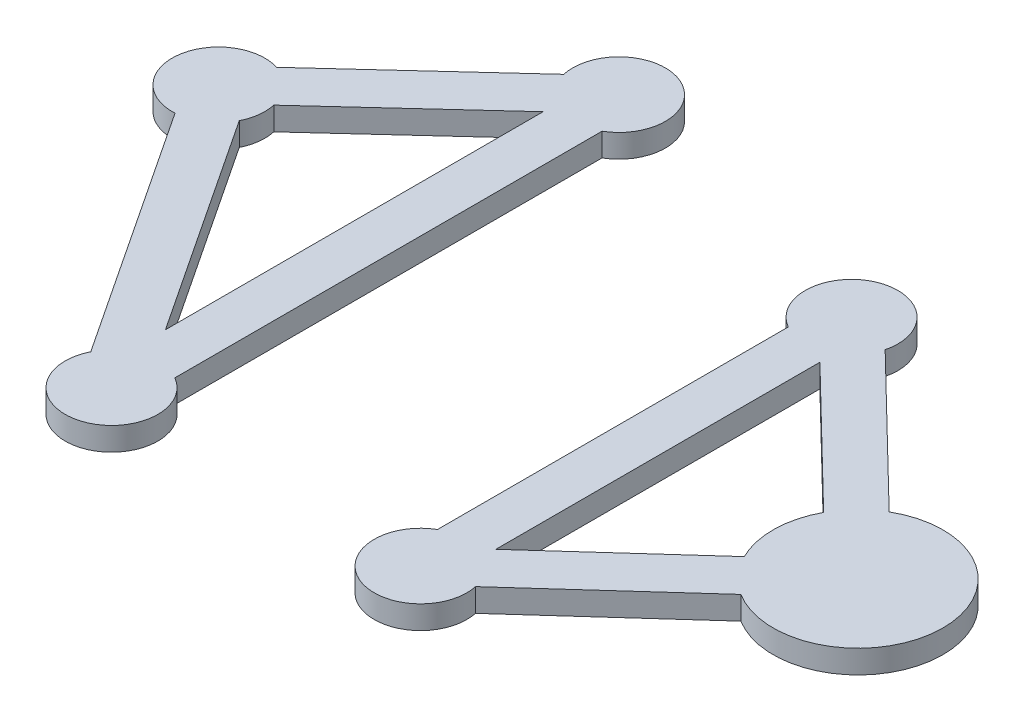
ISO-10303-21;
HEADER;
FILE_DESCRIPTION(('STEP AP214'),'2;1');
FILE_NAME('part.step','',(''),(''),'','','');
FILE_SCHEMA(('AUTOMOTIVE_DESIGN { 1 0 10303 214 1 1 1 1 }'));
ENDSEC;
DATA;
#1=APPLICATION_CONTEXT('core data for automotive mechanical design processes');
#2=APPLICATION_PROTOCOL_DEFINITION('international standard','automotive_design',2000,#1);
#3=PRODUCT_CONTEXT('',#1,'mechanical');
#4=PRODUCT('Part','Part','',(#3));
#5=PRODUCT_RELATED_PRODUCT_CATEGORY('part','',(#4));
#6=PRODUCT_DEFINITION_FORMATION('','',#4);
#7=PRODUCT_DEFINITION_CONTEXT('part definition',#1,'design');
#8=PRODUCT_DEFINITION('design','',#6,#7);
#9=PRODUCT_DEFINITION_SHAPE('','',#8);
#10=(LENGTH_UNIT() NAMED_UNIT(*) SI_UNIT(.MILLI.,.METRE.));
#11=(NAMED_UNIT(*) PLANE_ANGLE_UNIT() SI_UNIT($,.RADIAN.));
#12=(NAMED_UNIT(*) SI_UNIT($,.STERADIAN.) SOLID_ANGLE_UNIT());
#13=UNCERTAINTY_MEASURE_WITH_UNIT(LENGTH_MEASURE(1.E-05),#10,'distance_accuracy_value','');
#14=(GEOMETRIC_REPRESENTATION_CONTEXT(3) GLOBAL_UNCERTAINTY_ASSIGNED_CONTEXT((#13)) GLOBAL_UNIT_ASSIGNED_CONTEXT((#10,
#11,#12)) REPRESENTATION_CONTEXT('',''));
#15=CARTESIAN_POINT('',(0.,0.,0.));
#16=DIRECTION('',(0.,0.,1.));
#17=DIRECTION('',(1.,0.,0.));
#18=AXIS2_PLACEMENT_3D('',#15,#16,#17);
#19=CARTESIAN_POINT('',(0.,3.,0.));
#20=DIRECTION('',(0.,1.,0.));
#21=DIRECTION('',(0.,0.,1.));
#22=AXIS2_PLACEMENT_3D('',#19,#20,#21);
#23=PLANE('',#22);
#24=CARTESIAN_POINT('',(0.,3.,0.));
#25=DIRECTION('',(0.,1.,0.));
#26=DIRECTION('',(0.,0.,1.));
#27=AXIS2_PLACEMENT_3D('',#24,#25,#26);
#28=CIRCLE('',#27,6.);
#29=CARTESIAN_POINT('',(-2.99999999999999,3.,-5.19615242270664));
#30=VERTEX_POINT('',#29);
#31=CARTESIAN_POINT('',(5.86702734938971,3.,-1.2561807519275));
#32=VERTEX_POINT('',#31);
#33=EDGE_CURVE('E166',#30,#32,#28,.T.);
#34=ORIENTED_EDGE('',*,*,#33,.T.);
#35=DIRECTION('',(0.742150725550953,0.,-0.670233019601537));
#36=VECTOR('',#35,1.);
#37=CARTESIAN_POINT('',(5.86702734938971,3.,-1.2561807519275));
#38=LINE('',#37,#36);
#39=CARTESIAN_POINT('',(23.916758132862,3.,-17.5568123480505));
#40=VERTEX_POINT('',#39);
#41=EDGE_CURVE('E170',#32,#40,#38,.T.);
#42=ORIENTED_EDGE('',*,*,#41,.T.);
#43=CARTESIAN_POINT('',(29.7602440945933,3.,-26.8763440860215));
#44=DIRECTION('',(0.,1.,0.));
#45=DIRECTION('',(0.,0.,1.));
#46=AXIS2_PLACEMENT_3D('',#43,#44,#45);
#47=CIRCLE('',#46,11.);
#48=CARTESIAN_POINT('',(24.2618862251584,3.,-36.4035714234803));
#49=VERTEX_POINT('',#48);
#50=EDGE_CURVE('E172',#40,#49,#47,.T.);
#51=ORIENTED_EDGE('',*,*,#50,.T.);
#52=DIRECTION('',(-0.717114315532369,0.,-0.696955564192253));
#53=VECTOR('',#52,1.);
#54=CARTESIAN_POINT('',(5.81710198058792,3.,-54.3298556032008));
#55=LINE('',#54,#53);
#56=CARTESIAN_POINT('',(5.81710198058792,3.,-54.3298556032008));
#57=VERTEX_POINT('',#56);
#58=EDGE_CURVE('E174',#49,#57,#55,.T.);
#59=ORIENTED_EDGE('',*,*,#58,.T.);
#60=CARTESIAN_POINT('',(0.,3.,-55.8));
#61=DIRECTION('',(0.,1.,0.));
#62=DIRECTION('',(0.,0.,1.));
#63=AXIS2_PLACEMENT_3D('',#60,#61,#62);
#64=CIRCLE('',#63,6.);
#65=CARTESIAN_POINT('',(-3.,3.,-50.6038475772934));
#66=VERTEX_POINT('',#65);
#67=EDGE_CURVE('E176',#57,#66,#64,.T.);
#68=ORIENTED_EDGE('',*,*,#67,.T.);
#69=DIRECTION('',(0.,0.,1.));
#70=VECTOR('',#69,1.);
#71=CARTESIAN_POINT('',(-3.,3.,-50.6038475772934));
#72=LINE('',#71,#70);
#73=EDGE_CURVE('E178',#66,#30,#72,.T.);
#74=ORIENTED_EDGE('',*,*,#73,.T.);
#75=EDGE_LOOP('',(#34,#42,#51,#59,#68,#74));
#76=FACE_BOUND('',#75,.T.);
#77=DIRECTION('',(-0.717114315532369,0.,-0.696955564192253));
#78=VECTOR('',#77,1.);
#79=CARTESIAN_POINT('',(3.00000000000001,3.,-48.7008993652603));
#80=LINE('',#79,#78);
#81=CARTESIAN_POINT('',(20.0801528400048,3.,-32.1008855302861));
#82=VERTEX_POINT('',#81);
#83=CARTESIAN_POINT('',(3.00000000000001,3.,-48.7008993652603));
#84=VERTEX_POINT('',#83);
#85=EDGE_CURVE('E81',#82,#84,#80,.T.);
#86=ORIENTED_EDGE('',*,*,#85,.F.);
#87=CARTESIAN_POINT('',(29.7602440945933,3.,-26.8763440860215));
#88=DIRECTION('',(0.,-1.,0.));
#89=DIRECTION('',(0.,0.,1.));
#90=AXIS2_PLACEMENT_3D('',#87,#88,#89);
#91=CIRCLE('',#90,11.);
#92=CARTESIAN_POINT('',(19.8953600152528,3.,-22.0097167013562));
#93=VERTEX_POINT('',#92);
#94=EDGE_CURVE('E55',#93,#82,#91,.T.);
#95=ORIENTED_EDGE('',*,*,#94,.F.);
#96=DIRECTION('',(0.742150725550956,0.,-0.670233019601534));
#97=VECTOR('',#96,1.);
#98=CARTESIAN_POINT('',(19.8953600152528,3.,-22.0097167013562));
#99=LINE('',#98,#97);
#100=CARTESIAN_POINT('',(3.,3.,-6.75159221206013));
#101=VERTEX_POINT('',#100);
#102=EDGE_CURVE('E137',#101,#93,#99,.T.);
#103=ORIENTED_EDGE('',*,*,#102,.F.);
#104=DIRECTION('',(0.,0.,1.));
#105=VECTOR('',#104,1.);
#106=CARTESIAN_POINT('',(3.00000000000001,3.,-6.75159221206013));
#107=LINE('',#106,#105);
#108=EDGE_CURVE('E145',#84,#101,#107,.T.);
#109=ORIENTED_EDGE('',*,*,#108,.F.);
#110=EDGE_LOOP('',(#86,#95,#103,#109));
#111=FACE_BOUND('',#110,.T.);
#112=ADVANCED_FACE('F51',(#76,#111),#23,.T.);
#113=CARTESIAN_POINT('',(0.,0.,0.));
#114=DIRECTION('',(0.,1.,0.));
#115=DIRECTION('',(0.,0.,1.));
#116=AXIS2_PLACEMENT_3D('',#113,#114,#115);
#117=PLANE('',#116);
#118=CARTESIAN_POINT('',(0.,0.,0.));
#119=DIRECTION('',(0.,1.,0.));
#120=DIRECTION('',(0.,0.,1.));
#121=AXIS2_PLACEMENT_3D('',#118,#119,#120);
#122=CIRCLE('',#121,6.);
#123=CARTESIAN_POINT('',(-2.99999999999999,0.,-5.19615242270664));
#124=VERTEX_POINT('',#123);
#125=CARTESIAN_POINT('',(5.86702734938971,0.,-1.2561807519275));
#126=VERTEX_POINT('',#125);
#127=EDGE_CURVE('E159',#124,#126,#122,.T.);
#128=ORIENTED_EDGE('',*,*,#127,.F.);
#129=DIRECTION('',(0.,0.,1.));
#130=VECTOR('',#129,1.);
#131=CARTESIAN_POINT('',(-3.,0.,-50.6038475772934));
#132=LINE('',#131,#130);
#133=CARTESIAN_POINT('',(-3.,0.,-50.6038475772934));
#134=VERTEX_POINT('',#133);
#135=EDGE_CURVE('E169',#134,#124,#132,.T.);
#136=ORIENTED_EDGE('',*,*,#135,.F.);
#137=CARTESIAN_POINT('',(0.,0.,-55.8));
#138=DIRECTION('',(0.,1.,0.));
#139=DIRECTION('',(0.,0.,1.));
#140=AXIS2_PLACEMENT_3D('',#137,#138,#139);
#141=CIRCLE('',#140,6.);
#142=CARTESIAN_POINT('',(5.81710198058792,0.,-54.3298556032008));
#143=VERTEX_POINT('',#142);
#144=EDGE_CURVE('E186',#143,#134,#141,.T.);
#145=ORIENTED_EDGE('',*,*,#144,.F.);
#146=DIRECTION('',(-0.717114315532369,0.,-0.696955564192253));
#147=VECTOR('',#146,1.);
#148=CARTESIAN_POINT('',(5.81710198058792,0.,-54.3298556032008));
#149=LINE('',#148,#147);
#150=CARTESIAN_POINT('',(24.2618862251584,0.,-36.4035714234803));
#151=VERTEX_POINT('',#150);
#152=EDGE_CURVE('E184',#151,#143,#149,.T.);
#153=ORIENTED_EDGE('',*,*,#152,.F.);
#154=CARTESIAN_POINT('',(29.7602440945933,0.,-26.8763440860215));
#155=DIRECTION('',(0.,1.,0.));
#156=DIRECTION('',(0.,0.,1.));
#157=AXIS2_PLACEMENT_3D('',#154,#155,#156);
#158=CIRCLE('',#157,11.);
#159=CARTESIAN_POINT('',(23.916758132862,0.,-17.5568123480505));
#160=VERTEX_POINT('',#159);
#161=EDGE_CURVE('E182',#160,#151,#158,.T.);
#162=ORIENTED_EDGE('',*,*,#161,.F.);
#163=DIRECTION('',(0.742150725550953,0.,-0.670233019601537));
#164=VECTOR('',#163,1.);
#165=CARTESIAN_POINT('',(5.86702734938971,0.,-1.2561807519275));
#166=LINE('',#165,#164);
#167=EDGE_CURVE('E163',#126,#160,#166,.T.);
#168=ORIENTED_EDGE('',*,*,#167,.F.);
#169=EDGE_LOOP('',(#128,#136,#145,#153,#162,#168));
#170=FACE_BOUND('',#169,.T.);
#171=CARTESIAN_POINT('',(29.7602440945933,0.,-26.8763440860215));
#172=DIRECTION('',(0.,-1.,0.));
#173=DIRECTION('',(0.,0.,1.));
#174=AXIS2_PLACEMENT_3D('',#171,#172,#173);
#175=CIRCLE('',#174,11.);
#176=CARTESIAN_POINT('',(19.8953600152528,0.,-22.0097167013562));
#177=VERTEX_POINT('',#176);
#178=CARTESIAN_POINT('',(20.0801528400048,0.,-32.1008855302861));
#179=VERTEX_POINT('',#178);
#180=EDGE_CURVE('E12',#177,#179,#175,.T.);
#181=ORIENTED_EDGE('',*,*,#180,.T.);
#182=DIRECTION('',(-0.717114315532369,0.,-0.696955564192253));
#183=VECTOR('',#182,1.);
#184=CARTESIAN_POINT('',(3.00000000000001,0.,-48.7008993652603));
#185=LINE('',#184,#183);
#186=CARTESIAN_POINT('',(3.00000000000001,0.,-48.7008993652603));
#187=VERTEX_POINT('',#186);
#188=EDGE_CURVE('E61',#179,#187,#185,.T.);
#189=ORIENTED_EDGE('',*,*,#188,.T.);
#190=DIRECTION('',(0.,0.,1.));
#191=VECTOR('',#190,1.);
#192=CARTESIAN_POINT('',(3.00000000000001,0.,-6.75159221206013));
#193=LINE('',#192,#191);
#194=CARTESIAN_POINT('',(3.00000000000001,0.,-6.75159221206013));
#195=VERTEX_POINT('',#194);
#196=EDGE_CURVE('E152',#187,#195,#193,.T.);
#197=ORIENTED_EDGE('',*,*,#196,.T.);
#198=DIRECTION('',(0.742150725550956,0.,-0.670233019601534));
#199=VECTOR('',#198,1.);
#200=CARTESIAN_POINT('',(19.8953600152528,0.,-22.0097167013562));
#201=LINE('',#200,#199);
#202=EDGE_CURVE('E139',#195,#177,#201,.T.);
#203=ORIENTED_EDGE('',*,*,#202,.T.);
#204=EDGE_LOOP('',(#181,#189,#197,#203));
#205=FACE_BOUND('',#204,.T.);
#206=ADVANCED_FACE('F156',(#170,#205),#117,.F.);
#207=CARTESIAN_POINT('',(0.,3.,0.));
#208=DIRECTION('',(0.,-1.,0.));
#209=DIRECTION('',(0.,0.,-1.));
#210=AXIS2_PLACEMENT_3D('',#207,#208,#209);
#211=CYLINDRICAL_SURFACE('',#210,6.);
#212=ORIENTED_EDGE('',*,*,#127,.T.);
#213=DIRECTION('',(0.,-1.,0.));
#214=VECTOR('',#213,1.);
#215=CARTESIAN_POINT('',(5.86702734938971,3.,-1.2561807519275));
#216=LINE('',#215,#214);
#217=EDGE_CURVE('E203',#32,#126,#216,.T.);
#218=ORIENTED_EDGE('',*,*,#217,.F.);
#219=ORIENTED_EDGE('',*,*,#33,.F.);
#220=DIRECTION('',(0.,-1.,0.));
#221=VECTOR('',#220,1.);
#222=CARTESIAN_POINT('',(-2.99999999999999,3.,-5.19615242270664));
#223=LINE('',#222,#221);
#224=EDGE_CURVE('E179',#30,#124,#223,.T.);
#225=ORIENTED_EDGE('',*,*,#224,.T.);
#226=EDGE_LOOP('',(#212,#218,#219,#225));
#227=FACE_BOUND('',#226,.T.);
#228=ADVANCED_FACE('F212',(#227),#211,.T.);
#229=CARTESIAN_POINT('',(5.86702734938971,3.,-1.2561807519275));
#230=DIRECTION('',(-0.670233019601537,0.,-0.742150725550953));
#231=DIRECTION('',(-0.742150725550953,0.,0.670233019601537));
#232=AXIS2_PLACEMENT_3D('',#229,#230,#231);
#233=PLANE('',#232);
#234=ORIENTED_EDGE('',*,*,#167,.T.);
#235=DIRECTION('',(0.,-1.,0.));
#236=VECTOR('',#235,1.);
#237=CARTESIAN_POINT('',(23.916758132862,3.,-17.5568123480505));
#238=LINE('',#237,#236);
#239=EDGE_CURVE('E200',#40,#160,#238,.T.);
#240=ORIENTED_EDGE('',*,*,#239,.F.);
#241=ORIENTED_EDGE('',*,*,#41,.F.);
#242=ORIENTED_EDGE('',*,*,#217,.T.);
#243=EDGE_LOOP('',(#234,#240,#241,#242));
#244=FACE_BOUND('',#243,.T.);
#245=ADVANCED_FACE('F207',(#244),#233,.F.);
#246=CARTESIAN_POINT('',(29.7602440945933,3.,-26.8763440860215));
#247=DIRECTION('',(0.,-1.,0.));
#248=DIRECTION('',(0.,0.,-1.));
#249=AXIS2_PLACEMENT_3D('',#246,#247,#248);
#250=CYLINDRICAL_SURFACE('',#249,11.);
#251=ORIENTED_EDGE('',*,*,#161,.T.);
#252=DIRECTION('',(0.,-1.,0.));
#253=VECTOR('',#252,1.);
#254=CARTESIAN_POINT('',(24.2618862251584,3.,-36.4035714234803));
#255=LINE('',#254,#253);
#256=EDGE_CURVE('E197',#49,#151,#255,.T.);
#257=ORIENTED_EDGE('',*,*,#256,.F.);
#258=ORIENTED_EDGE('',*,*,#50,.F.);
#259=ORIENTED_EDGE('',*,*,#239,.T.);
#260=EDGE_LOOP('',(#251,#257,#258,#259));
#261=FACE_BOUND('',#260,.T.);
#262=ADVANCED_FACE('F221',(#261),#250,.T.);
#263=CARTESIAN_POINT('',(5.81710198058792,3.,-54.3298556032008));
#264=DIRECTION('',(-0.696955564192253,0.,0.717114315532369));
#265=DIRECTION('',(0.717114315532369,0.,0.696955564192253));
#266=AXIS2_PLACEMENT_3D('',#263,#264,#265);
#267=PLANE('',#266);
#268=ORIENTED_EDGE('',*,*,#152,.T.);
#269=DIRECTION('',(0.,-1.,0.));
#270=VECTOR('',#269,1.);
#271=CARTESIAN_POINT('',(5.81710198058792,3.,-54.3298556032008));
#272=LINE('',#271,#270);
#273=EDGE_CURVE('E194',#57,#143,#272,.T.);
#274=ORIENTED_EDGE('',*,*,#273,.F.);
#275=ORIENTED_EDGE('',*,*,#58,.F.);
#276=ORIENTED_EDGE('',*,*,#256,.T.);
#277=EDGE_LOOP('',(#268,#274,#275,#276));
#278=FACE_BOUND('',#277,.T.);
#279=ADVANCED_FACE('F225',(#278),#267,.F.);
#280=CARTESIAN_POINT('',(0.,3.,-55.8));
#281=DIRECTION('',(0.,-1.,0.));
#282=DIRECTION('',(0.,0.,-1.));
#283=AXIS2_PLACEMENT_3D('',#280,#281,#282);
#284=CYLINDRICAL_SURFACE('',#283,6.);
#285=ORIENTED_EDGE('',*,*,#144,.T.);
#286=DIRECTION('',(0.,-1.,0.));
#287=VECTOR('',#286,1.);
#288=CARTESIAN_POINT('',(-3.,3.,-50.6038475772934));
#289=LINE('',#288,#287);
#290=EDGE_CURVE('E191',#66,#134,#289,.T.);
#291=ORIENTED_EDGE('',*,*,#290,.F.);
#292=ORIENTED_EDGE('',*,*,#67,.F.);
#293=ORIENTED_EDGE('',*,*,#273,.T.);
#294=EDGE_LOOP('',(#285,#291,#292,#293));
#295=FACE_BOUND('',#294,.T.);
#296=ADVANCED_FACE('F234',(#295),#284,.T.);
#297=CARTESIAN_POINT('',(-3.,3.,-50.6038475772934));
#298=DIRECTION('',(1.,0.,0.));
#299=DIRECTION('',(0.,0.,-1.));
#300=AXIS2_PLACEMENT_3D('',#297,#298,#299);
#301=PLANE('',#300);
#302=ORIENTED_EDGE('',*,*,#135,.T.);
#303=ORIENTED_EDGE('',*,*,#224,.F.);
#304=ORIENTED_EDGE('',*,*,#73,.F.);
#305=ORIENTED_EDGE('',*,*,#290,.T.);
#306=EDGE_LOOP('',(#302,#303,#304,#305));
#307=FACE_BOUND('',#306,.T.);
#308=ADVANCED_FACE('F232',(#307),#301,.F.);
#309=CARTESIAN_POINT('',(29.7602440945933,3.,-26.8763440860215));
#310=DIRECTION('',(0.,-1.,0.));
#311=DIRECTION('',(0.,0.,-1.));
#312=AXIS2_PLACEMENT_3D('',#309,#310,#311);
#313=CYLINDRICAL_SURFACE('',#312,11.);
#314=ORIENTED_EDGE('',*,*,#180,.F.);
#315=DIRECTION('',(0.,-1.,0.));
#316=VECTOR('',#315,1.);
#317=CARTESIAN_POINT('',(19.8953600152528,3.,-22.0097167013562));
#318=LINE('',#317,#316);
#319=EDGE_CURVE('E141',#93,#177,#318,.T.);
#320=ORIENTED_EDGE('',*,*,#319,.F.);
#321=ORIENTED_EDGE('',*,*,#94,.T.);
#322=DIRECTION('',(0.,-1.,0.));
#323=VECTOR('',#322,1.);
#324=CARTESIAN_POINT('',(20.0801528400048,3.,-32.1008855302861));
#325=LINE('',#324,#323);
#326=EDGE_CURVE('E158',#82,#179,#325,.T.);
#327=ORIENTED_EDGE('',*,*,#326,.T.);
#328=EDGE_LOOP('',(#314,#320,#321,#327));
#329=FACE_BOUND('',#328,.T.);
#330=ADVANCED_FACE('F157',(#329),#313,.T.);
#331=CARTESIAN_POINT('',(3.00000000000001,3.,-48.7008993652603));
#332=DIRECTION('',(-0.696955564192253,0.,0.717114315532369));
#333=DIRECTION('',(0.717114315532369,0.,0.696955564192253));
#334=AXIS2_PLACEMENT_3D('',#331,#332,#333);
#335=PLANE('',#334);
#336=ORIENTED_EDGE('',*,*,#188,.F.);
#337=ORIENTED_EDGE('',*,*,#326,.F.);
#338=ORIENTED_EDGE('',*,*,#85,.T.);
#339=DIRECTION('',(0.,-1.,0.));
#340=VECTOR('',#339,1.);
#341=CARTESIAN_POINT('',(3.00000000000001,3.,-48.7008993652603));
#342=LINE('',#341,#340);
#343=EDGE_CURVE('E142',#84,#187,#342,.T.);
#344=ORIENTED_EDGE('',*,*,#343,.T.);
#345=EDGE_LOOP('',(#336,#337,#338,#344));
#346=FACE_BOUND('',#345,.T.);
#347=ADVANCED_FACE('F252',(#346),#335,.T.);
#348=CARTESIAN_POINT('',(3.00000000000001,3.,-6.75159221206013));
#349=DIRECTION('',(1.,0.,0.));
#350=DIRECTION('',(0.,0.,-1.));
#351=AXIS2_PLACEMENT_3D('',#348,#349,#350);
#352=PLANE('',#351);
#353=ORIENTED_EDGE('',*,*,#196,.F.);
#354=ORIENTED_EDGE('',*,*,#343,.F.);
#355=ORIENTED_EDGE('',*,*,#108,.T.);
#356=DIRECTION('',(0.,-1.,0.));
#357=VECTOR('',#356,1.);
#358=CARTESIAN_POINT('',(3.00000000000001,3.,-6.75159221206013));
#359=LINE('',#358,#357);
#360=EDGE_CURVE('E92',#101,#195,#359,.T.);
#361=ORIENTED_EDGE('',*,*,#360,.T.);
#362=EDGE_LOOP('',(#353,#354,#355,#361));
#363=FACE_BOUND('',#362,.T.);
#364=ADVANCED_FACE('F146',(#363),#352,.T.);
#365=CARTESIAN_POINT('',(19.8953600152528,3.,-22.0097167013562));
#366=DIRECTION('',(-0.670233019601534,0.,-0.742150725550956));
#367=DIRECTION('',(-0.742150725550956,0.,0.670233019601534));
#368=AXIS2_PLACEMENT_3D('',#365,#366,#367);
#369=PLANE('',#368);
#370=ORIENTED_EDGE('',*,*,#202,.F.);
#371=ORIENTED_EDGE('',*,*,#360,.F.);
#372=ORIENTED_EDGE('',*,*,#102,.T.);
#373=ORIENTED_EDGE('',*,*,#319,.T.);
#374=EDGE_LOOP('',(#370,#371,#372,#373));
#375=FACE_BOUND('',#374,.T.);
#376=ADVANCED_FACE('F53',(#375),#369,.T.);
#377=CLOSED_SHELL('',(#112,#206,#228,#245,#262,#279,#296,#308,#330,#347,#364,#376));
#378=MANIFOLD_SOLID_BREP('B2',#377);
#379=CARTESIAN_POINT('',(-67.0271654386819,3.,-40.8721461187215));
#380=DIRECTION('',(0.,-1.,0.));
#381=DIRECTION('',(0.,0.,-1.));
#382=AXIS2_PLACEMENT_3D('',#379,#380,#381);
#383=PLANE('',#382);
#384=CARTESIAN_POINT('',(-67.0271654386819,3.,-40.8721461187215));
#385=DIRECTION('',(0.,1.,0.));
#386=DIRECTION('',(0.,0.,-1.));
#387=AXIS2_PLACEMENT_3D('',#384,#385,#386);
#388=CIRCLE('',#387,6.);
#389=CARTESIAN_POINT('',(-65.2300616367947,3.,-46.5966913343035));
#390=VERTEX_POINT('',#389);
#391=CARTESIAN_POINT('',(-66.6634749730303,3.,-34.883178825006));
#392=VERTEX_POINT('',#391);
#393=EDGE_CURVE('E446',#390,#392,#388,.T.);
#394=ORIENTED_EDGE('',*,*,#393,.T.);
#395=DIRECTION('',(0.551574804871062,0.,0.834125430994314));
#396=VECTOR('',#395,1.);
#397=CARTESIAN_POINT('',(-66.6634749730303,3.,-34.883178825006));
#398=LINE('',#397,#396);
#399=CARTESIAN_POINT('',(-45.3684430516176,3.,-2.67951846448914));
#400=VERTEX_POINT('',#399);
#401=EDGE_CURVE('E449',#392,#400,#398,.T.);
#402=ORIENTED_EDGE('',*,*,#401,.T.);
#403=CARTESIAN_POINT('',(-40.,3.,0.));
#404=DIRECTION('',(0.,1.,0.));
#405=DIRECTION('',(0.,0.,1.));
#406=AXIS2_PLACEMENT_3D('',#403,#404,#405);
#407=CIRCLE('',#406,5.99999999999999);
#408=CARTESIAN_POINT('',(-37.,3.,-5.19615242270662));
#409=VERTEX_POINT('',#408);
#410=EDGE_CURVE('E452',#400,#409,#407,.T.);
#411=ORIENTED_EDGE('',*,*,#410,.T.);
#412=DIRECTION('',(0.,0.,-1.));
#413=VECTOR('',#412,1.);
#414=CARTESIAN_POINT('',(-37.,3.,-60.5038475772934));
#415=LINE('',#414,#413);
#416=CARTESIAN_POINT('',(-37.,3.,-60.5038475772934));
#417=VERTEX_POINT('',#416);
#418=EDGE_CURVE('E454',#409,#417,#415,.T.);
#419=ORIENTED_EDGE('',*,*,#418,.T.);
#420=CARTESIAN_POINT('',(-40.,3.,-65.7));
#421=DIRECTION('',(0.,1.,0.));
#422=DIRECTION('',(0.,0.,-1.));
#423=AXIS2_PLACEMENT_3D('',#420,#421,#422);
#424=CIRCLE('',#423,6.00000000000001);
#425=CARTESIAN_POINT('',(-45.8561534827503,3.,-64.3940649378811));
#426=VERTEX_POINT('',#425);
#427=EDGE_CURVE('E456',#417,#426,#424,.T.);
#428=ORIENTED_EDGE('',*,*,#427,.T.);
#429=DIRECTION('',(-0.736435025577166,0.,0.676508280143827));
#430=VECTOR('',#429,1.);
#431=CARTESIAN_POINT('',(-65.2300616367947,3.,-46.5966913343035));
#432=LINE('',#431,#430);
#433=EDGE_CURVE('E458',#426,#390,#432,.T.);
#434=ORIENTED_EDGE('',*,*,#433,.T.);
#435=EDGE_LOOP('',(#394,#402,#411,#419,#428,#434));
#436=FACE_BOUND('',#435,.T.);
#437=DIRECTION('',(0.,0.,-1.));
#438=VECTOR('',#437,1.);
#439=CARTESIAN_POINT('',(-43.,3.,-58.8704431949177));
#440=LINE('',#439,#438);
#441=CARTESIAN_POINT('',(-43.,3.,-9.97575713101908));
#442=VERTEX_POINT('',#441);
#443=CARTESIAN_POINT('',(-43.,3.,-58.8704431949177));
#444=VERTEX_POINT('',#443);
#445=EDGE_CURVE('E410',#442,#444,#440,.T.);
#446=ORIENTED_EDGE('',*,*,#445,.F.);
#447=DIRECTION('',(0.551574804871059,0.,0.834125430994316));
#448=VECTOR('',#447,1.);
#449=CARTESIAN_POINT('',(-43.,3.,-9.97575713101908));
#450=LINE('',#449,#448);
#451=CARTESIAN_POINT('',(-61.6587223870643,3.,-38.1926276542323));
#452=VERTEX_POINT('',#451);
#453=EDGE_CURVE('E432',#452,#442,#450,.T.);
#454=ORIENTED_EDGE('',*,*,#453,.F.);
#455=CARTESIAN_POINT('',(-67.0271654386819,3.,-40.8721461187215));
#456=DIRECTION('',(0.,-1.,0.));
#457=DIRECTION('',(0.,0.,-1.));
#458=AXIS2_PLACEMENT_3D('',#455,#456,#457);
#459=CIRCLE('',#458,5.99999999999999);
#460=CARTESIAN_POINT('',(-61.1710119559316,3.,-42.1780811808404));
#461=VERTEX_POINT('',#460);
#462=EDGE_CURVE('E430',#461,#452,#459,.T.);
#463=ORIENTED_EDGE('',*,*,#462,.F.);
#464=DIRECTION('',(-0.736435025577164,0.,0.67650828014383));
#465=VECTOR('',#464,1.);
#466=CARTESIAN_POINT('',(-61.1710119559316,3.,-42.1780811808404));
#467=LINE('',#466,#465);
#468=EDGE_CURVE('E418',#444,#461,#467,.T.);
#469=ORIENTED_EDGE('',*,*,#468,.F.);
#470=EDGE_LOOP('',(#446,#454,#463,#469));
#471=FACE_BOUND('',#470,.T.);
#472=ADVANCED_FACE('F333',(#436,#471),#383,.F.);
#473=CARTESIAN_POINT('',(-67.0271654386819,0.,-40.8721461187215));
#474=DIRECTION('',(0.,-1.,0.));
#475=DIRECTION('',(0.,0.,-1.));
#476=AXIS2_PLACEMENT_3D('',#473,#474,#475);
#477=PLANE('',#476);
#478=CARTESIAN_POINT('',(-67.0271654386819,0.,-40.8721461187215));
#479=DIRECTION('',(0.,1.,0.));
#480=DIRECTION('',(0.,0.,-1.));
#481=AXIS2_PLACEMENT_3D('',#478,#479,#480);
#482=CIRCLE('',#481,6.);
#483=CARTESIAN_POINT('',(-65.2300616367947,0.,-46.5966913343035));
#484=VERTEX_POINT('',#483);
#485=CARTESIAN_POINT('',(-66.6634749730303,0.,-34.883178825006));
#486=VERTEX_POINT('',#485);
#487=EDGE_CURVE('E426',#484,#486,#482,.T.);
#488=ORIENTED_EDGE('',*,*,#487,.F.);
#489=DIRECTION('',(-0.736435025577166,0.,0.676508280143827));
#490=VECTOR('',#489,1.);
#491=CARTESIAN_POINT('',(-65.2300616367947,0.,-46.5966913343035));
#492=LINE('',#491,#490);
#493=CARTESIAN_POINT('',(-45.8561534827503,0.,-64.3940649378811));
#494=VERTEX_POINT('',#493);
#495=EDGE_CURVE('E450',#494,#484,#492,.T.);
#496=ORIENTED_EDGE('',*,*,#495,.F.);
#497=CARTESIAN_POINT('',(-40.,0.,-65.7));
#498=DIRECTION('',(0.,1.,0.));
#499=DIRECTION('',(0.,0.,-1.));
#500=AXIS2_PLACEMENT_3D('',#497,#498,#499);
#501=CIRCLE('',#500,6.00000000000001);
#502=CARTESIAN_POINT('',(-37.,0.,-60.5038475772934));
#503=VERTEX_POINT('',#502);
#504=EDGE_CURVE('E469',#503,#494,#501,.T.);
#505=ORIENTED_EDGE('',*,*,#504,.F.);
#506=DIRECTION('',(0.,0.,-1.));
#507=VECTOR('',#506,1.);
#508=CARTESIAN_POINT('',(-37.,0.,-60.5038475772934));
#509=LINE('',#508,#507);
#510=CARTESIAN_POINT('',(-37.,0.,-5.19615242270662));
#511=VERTEX_POINT('',#510);
#512=EDGE_CURVE('E467',#511,#503,#509,.T.);
#513=ORIENTED_EDGE('',*,*,#512,.F.);
#514=CARTESIAN_POINT('',(-40.,0.,0.));
#515=DIRECTION('',(0.,1.,0.));
#516=DIRECTION('',(0.,0.,1.));
#517=AXIS2_PLACEMENT_3D('',#514,#515,#516);
#518=CIRCLE('',#517,5.99999999999999);
#519=CARTESIAN_POINT('',(-45.3684430516176,0.,-2.67951846448914));
#520=VERTEX_POINT('',#519);
#521=EDGE_CURVE('E465',#520,#511,#518,.T.);
#522=ORIENTED_EDGE('',*,*,#521,.F.);
#523=DIRECTION('',(0.551574804871062,0.,0.834125430994314));
#524=VECTOR('',#523,1.);
#525=CARTESIAN_POINT('',(-66.6634749730303,0.,-34.883178825006));
#526=LINE('',#525,#524);
#527=EDGE_CURVE('E463',#486,#520,#526,.T.);
#528=ORIENTED_EDGE('',*,*,#527,.F.);
#529=EDGE_LOOP('',(#488,#496,#505,#513,#522,#528));
#530=FACE_BOUND('',#529,.T.);
#531=DIRECTION('',(0.551574804871059,0.,0.834125430994316));
#532=VECTOR('',#531,1.);
#533=CARTESIAN_POINT('',(-43.,0.,-9.97575713101908));
#534=LINE('',#533,#532);
#535=CARTESIAN_POINT('',(-61.6587223870643,0.,-38.1926276542323));
#536=VERTEX_POINT('',#535);
#537=CARTESIAN_POINT('',(-43.,0.,-9.97575713101908));
#538=VERTEX_POINT('',#537);
#539=EDGE_CURVE('E419',#536,#538,#534,.T.);
#540=ORIENTED_EDGE('',*,*,#539,.T.);
#541=DIRECTION('',(0.,0.,-1.));
#542=VECTOR('',#541,1.);
#543=CARTESIAN_POINT('',(-43.,0.,-58.8704431949177));
#544=LINE('',#543,#542);
#545=CARTESIAN_POINT('',(-43.,0.,-58.8704431949177));
#546=VERTEX_POINT('',#545);
#547=EDGE_CURVE('E356',#538,#546,#544,.T.);
#548=ORIENTED_EDGE('',*,*,#547,.T.);
#549=DIRECTION('',(-0.736435025577164,0.,0.67650828014383));
#550=VECTOR('',#549,1.);
#551=CARTESIAN_POINT('',(-61.1710119559316,0.,-42.1780811808404));
#552=LINE('',#551,#550);
#553=CARTESIAN_POINT('',(-61.1710119559316,0.,-42.1780811808404));
#554=VERTEX_POINT('',#553);
#555=EDGE_CURVE('E425',#546,#554,#552,.T.);
#556=ORIENTED_EDGE('',*,*,#555,.T.);
#557=CARTESIAN_POINT('',(-67.0271654386819,0.,-40.8721461187215));
#558=DIRECTION('',(0.,-1.,0.));
#559=DIRECTION('',(0.,0.,-1.));
#560=AXIS2_PLACEMENT_3D('',#557,#558,#559);
#561=CIRCLE('',#560,5.99999999999999);
#562=EDGE_CURVE('E438',#554,#536,#561,.T.);
#563=ORIENTED_EDGE('',*,*,#562,.T.);
#564=EDGE_LOOP('',(#540,#548,#556,#563));
#565=FACE_BOUND('',#564,.T.);
#566=ADVANCED_FACE('F493',(#530,#565),#477,.T.);
#567=CARTESIAN_POINT('',(-67.0271654386819,3.,-40.8721461187215));
#568=DIRECTION('',(0.,-1.,0.));
#569=DIRECTION('',(0.,0.,-1.));
#570=AXIS2_PLACEMENT_3D('',#567,#568,#569);
#571=CYLINDRICAL_SURFACE('',#570,6.);
#572=ORIENTED_EDGE('',*,*,#487,.T.);
#573=DIRECTION('',(0.,-1.,0.));
#574=VECTOR('',#573,1.);
#575=CARTESIAN_POINT('',(-66.6634749730303,3.,-34.883178825006));
#576=LINE('',#575,#574);
#577=EDGE_CURVE('E49',#392,#486,#576,.T.);
#578=ORIENTED_EDGE('',*,*,#577,.F.);
#579=ORIENTED_EDGE('',*,*,#393,.F.);
#580=DIRECTION('',(0.,-1.,0.));
#581=VECTOR('',#580,1.);
#582=CARTESIAN_POINT('',(-65.2300616367947,3.,-46.5966913343035));
#583=LINE('',#582,#581);
#584=EDGE_CURVE('E460',#390,#484,#583,.T.);
#585=ORIENTED_EDGE('',*,*,#584,.T.);
#586=EDGE_LOOP('',(#572,#578,#579,#585));
#587=FACE_BOUND('',#586,.T.);
#588=ADVANCED_FACE('F335',(#587),#571,.T.);
#589=CARTESIAN_POINT('',(-66.6634749730303,3.,-34.883178825006));
#590=DIRECTION('',(0.834125430994314,0.,-0.551574804871062));
#591=DIRECTION('',(-0.551574804871062,0.,-0.834125430994314));
#592=AXIS2_PLACEMENT_3D('',#589,#590,#591);
#593=PLANE('',#592);
#594=ORIENTED_EDGE('',*,*,#527,.T.);
#595=DIRECTION('',(0.,-1.,0.));
#596=VECTOR('',#595,1.);
#597=CARTESIAN_POINT('',(-45.3684430516176,3.,-2.67951846448914));
#598=LINE('',#597,#596);
#599=EDGE_CURVE('E341',#400,#520,#598,.T.);
#600=ORIENTED_EDGE('',*,*,#599,.F.);
#601=ORIENTED_EDGE('',*,*,#401,.F.);
#602=ORIENTED_EDGE('',*,*,#577,.T.);
#603=EDGE_LOOP('',(#594,#600,#601,#602));
#604=FACE_BOUND('',#603,.T.);
#605=ADVANCED_FACE('F510',(#604),#593,.F.);
#606=CARTESIAN_POINT('',(-40.,3.,0.));
#607=DIRECTION('',(0.,-1.,0.));
#608=DIRECTION('',(0.,0.,-1.));
#609=AXIS2_PLACEMENT_3D('',#606,#607,#608);
#610=CYLINDRICAL_SURFACE('',#609,5.99999999999999);
#611=ORIENTED_EDGE('',*,*,#521,.T.);
#612=DIRECTION('',(0.,-1.,0.));
#613=VECTOR('',#612,1.);
#614=CARTESIAN_POINT('',(-37.,3.,-5.19615242270662));
#615=LINE('',#614,#613);
#616=EDGE_CURVE('E480',#409,#511,#615,.T.);
#617=ORIENTED_EDGE('',*,*,#616,.F.);
#618=ORIENTED_EDGE('',*,*,#410,.F.);
#619=ORIENTED_EDGE('',*,*,#599,.T.);
#620=EDGE_LOOP('',(#611,#617,#618,#619));
#621=FACE_BOUND('',#620,.T.);
#622=ADVANCED_FACE('F487',(#621),#610,.T.);
#623=CARTESIAN_POINT('',(-37.,3.,-60.5038475772934));
#624=DIRECTION('',(-1.,0.,0.));
#625=DIRECTION('',(0.,0.,1.));
#626=AXIS2_PLACEMENT_3D('',#623,#624,#625);
#627=PLANE('',#626);
#628=ORIENTED_EDGE('',*,*,#512,.T.);
#629=DIRECTION('',(0.,-1.,0.));
#630=VECTOR('',#629,1.);
#631=CARTESIAN_POINT('',(-37.,3.,-60.5038475772934));
#632=LINE('',#631,#630);
#633=EDGE_CURVE('E477',#417,#503,#632,.T.);
#634=ORIENTED_EDGE('',*,*,#633,.F.);
#635=ORIENTED_EDGE('',*,*,#418,.F.);
#636=ORIENTED_EDGE('',*,*,#616,.T.);
#637=EDGE_LOOP('',(#628,#634,#635,#636));
#638=FACE_BOUND('',#637,.T.);
#639=ADVANCED_FACE('F499',(#638),#627,.F.);
#640=CARTESIAN_POINT('',(-40.,3.,-65.7));
#641=DIRECTION('',(0.,-1.,0.));
#642=DIRECTION('',(0.,0.,-1.));
#643=AXIS2_PLACEMENT_3D('',#640,#641,#642);
#644=CYLINDRICAL_SURFACE('',#643,6.00000000000001);
#645=ORIENTED_EDGE('',*,*,#504,.T.);
#646=DIRECTION('',(0.,-1.,0.));
#647=VECTOR('',#646,1.);
#648=CARTESIAN_POINT('',(-45.8561534827503,3.,-64.3940649378811));
#649=LINE('',#648,#647);
#650=EDGE_CURVE('E474',#426,#494,#649,.T.);
#651=ORIENTED_EDGE('',*,*,#650,.F.);
#652=ORIENTED_EDGE('',*,*,#427,.F.);
#653=ORIENTED_EDGE('',*,*,#633,.T.);
#654=EDGE_LOOP('',(#645,#651,#652,#653));
#655=FACE_BOUND('',#654,.T.);
#656=ADVANCED_FACE('F503',(#655),#644,.T.);
#657=CARTESIAN_POINT('',(-65.2300616367947,3.,-46.5966913343035));
#658=DIRECTION('',(0.676508280143827,0.,0.736435025577166));
#659=DIRECTION('',(0.736435025577166,0.,-0.676508280143827));
#660=AXIS2_PLACEMENT_3D('',#657,#658,#659);
#661=PLANE('',#660);
#662=ORIENTED_EDGE('',*,*,#495,.T.);
#663=ORIENTED_EDGE('',*,*,#584,.F.);
#664=ORIENTED_EDGE('',*,*,#433,.F.);
#665=ORIENTED_EDGE('',*,*,#650,.T.);
#666=EDGE_LOOP('',(#662,#663,#664,#665));
#667=FACE_BOUND('',#666,.T.);
#668=ADVANCED_FACE('F513',(#667),#661,.F.);
#669=CARTESIAN_POINT('',(-43.,3.,-58.8704431949177));
#670=DIRECTION('',(-1.,0.,0.));
#671=DIRECTION('',(0.,0.,1.));
#672=AXIS2_PLACEMENT_3D('',#669,#670,#671);
#673=PLANE('',#672);
#674=ORIENTED_EDGE('',*,*,#547,.F.);
#675=DIRECTION('',(0.,-1.,0.));
#676=VECTOR('',#675,1.);
#677=CARTESIAN_POINT('',(-43.,3.,-9.97575713101908));
#678=LINE('',#677,#676);
#679=EDGE_CURVE('E414',#442,#538,#678,.T.);
#680=ORIENTED_EDGE('',*,*,#679,.F.);
#681=ORIENTED_EDGE('',*,*,#445,.T.);
#682=DIRECTION('',(0.,-1.,0.));
#683=VECTOR('',#682,1.);
#684=CARTESIAN_POINT('',(-43.,3.,-58.8704431949177));
#685=LINE('',#684,#683);
#686=EDGE_CURVE('E413',#444,#546,#685,.T.);
#687=ORIENTED_EDGE('',*,*,#686,.T.);
#688=EDGE_LOOP('',(#674,#680,#681,#687));
#689=FACE_BOUND('',#688,.T.);
#690=ADVANCED_FACE('F412',(#689),#673,.T.);
#691=CARTESIAN_POINT('',(-61.1710119559316,3.,-42.1780811808404));
#692=DIRECTION('',(0.67650828014383,0.,0.736435025577164));
#693=DIRECTION('',(0.736435025577164,0.,-0.67650828014383));
#694=AXIS2_PLACEMENT_3D('',#691,#692,#693);
#695=PLANE('',#694);
#696=ORIENTED_EDGE('',*,*,#555,.F.);
#697=ORIENTED_EDGE('',*,*,#686,.F.);
#698=ORIENTED_EDGE('',*,*,#468,.T.);
#699=DIRECTION('',(0.,-1.,0.));
#700=VECTOR('',#699,1.);
#701=CARTESIAN_POINT('',(-61.1710119559316,3.,-42.1780811808404));
#702=LINE('',#701,#700);
#703=EDGE_CURVE('E427',#461,#554,#702,.T.);
#704=ORIENTED_EDGE('',*,*,#703,.T.);
#705=EDGE_LOOP('',(#696,#697,#698,#704));
#706=FACE_BOUND('',#705,.T.);
#707=ADVANCED_FACE('F422',(#706),#695,.T.);
#708=CARTESIAN_POINT('',(-67.0271654386819,3.,-40.8721461187215));
#709=DIRECTION('',(0.,-1.,0.));
#710=DIRECTION('',(0.,0.,-1.));
#711=AXIS2_PLACEMENT_3D('',#708,#709,#710);
#712=CYLINDRICAL_SURFACE('',#711,5.99999999999999);
#713=ORIENTED_EDGE('',*,*,#562,.F.);
#714=ORIENTED_EDGE('',*,*,#703,.F.);
#715=ORIENTED_EDGE('',*,*,#462,.T.);
#716=DIRECTION('',(0.,-1.,0.));
#717=VECTOR('',#716,1.);
#718=CARTESIAN_POINT('',(-61.6587223870643,3.,-38.1926276542323));
#719=LINE('',#718,#717);
#720=EDGE_CURVE('E348',#452,#536,#719,.T.);
#721=ORIENTED_EDGE('',*,*,#720,.T.);
#722=EDGE_LOOP('',(#713,#714,#715,#721));
#723=FACE_BOUND('',#722,.T.);
#724=ADVANCED_FACE('F531',(#723),#712,.T.);
#725=CARTESIAN_POINT('',(-43.,3.,-9.97575713101908));
#726=DIRECTION('',(0.834125430994316,0.,-0.551574804871059));
#727=DIRECTION('',(-0.551574804871059,0.,-0.834125430994316));
#728=AXIS2_PLACEMENT_3D('',#725,#726,#727);
#729=PLANE('',#728);
#730=ORIENTED_EDGE('',*,*,#539,.F.);
#731=ORIENTED_EDGE('',*,*,#720,.F.);
#732=ORIENTED_EDGE('',*,*,#453,.T.);
#733=ORIENTED_EDGE('',*,*,#679,.T.);
#734=EDGE_LOOP('',(#730,#731,#732,#733));
#735=FACE_BOUND('',#734,.T.);
#736=ADVANCED_FACE('F534',(#735),#729,.T.);
#737=CLOSED_SHELL('',(#472,#566,#588,#605,#622,#639,#656,#668,#690,#707,#724,#736));
#738=MANIFOLD_SOLID_BREP('B6',#737);
#739=ADVANCED_BREP_SHAPE_REPRESENTATION('',(#18,#378,#738),#14);
#740=SHAPE_DEFINITION_REPRESENTATION(#9,#739);
ENDSEC;
END-ISO-10303-21;
